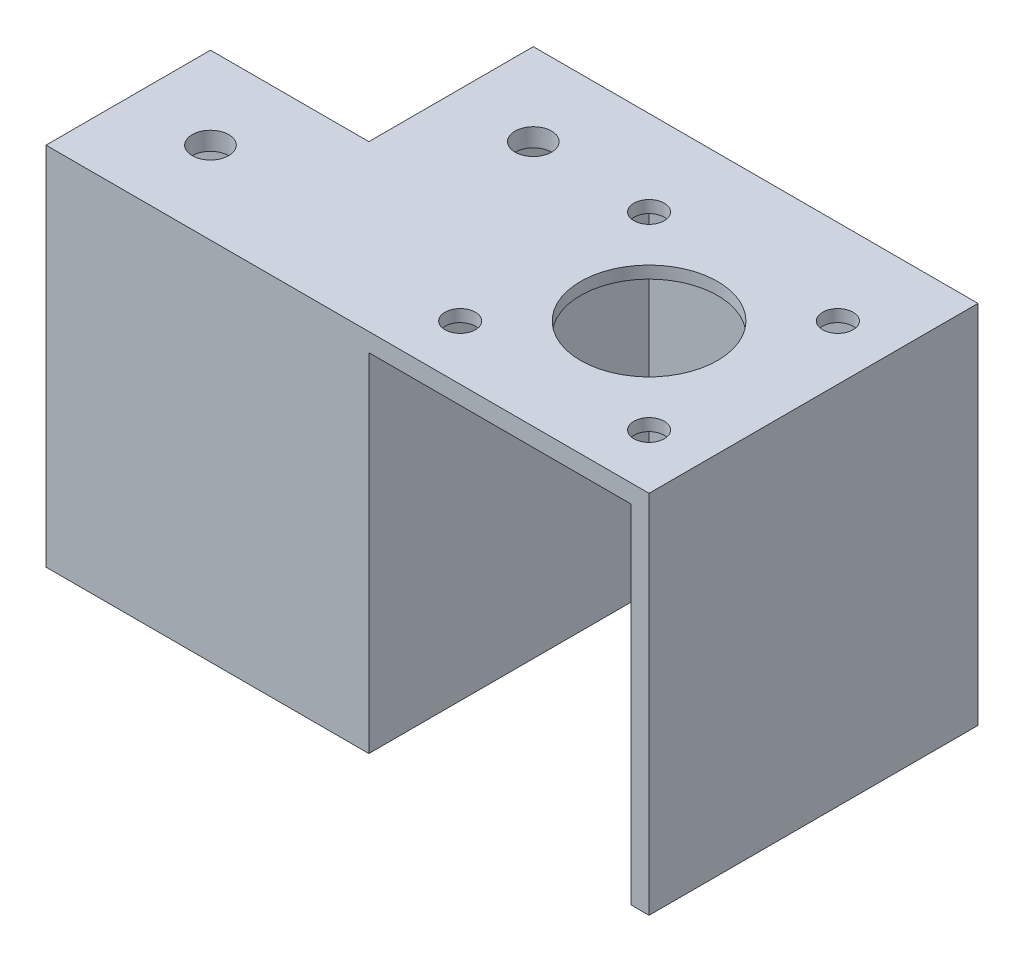
ISO-10303-21;
HEADER;
FILE_DESCRIPTION(('STEP AP214'),'2;1');
FILE_NAME('part.step','',(''),(''),'','','');
FILE_SCHEMA(('AUTOMOTIVE_DESIGN { 1 0 10303 214 1 1 1 1 }'));
ENDSEC;
DATA;
#1=APPLICATION_CONTEXT('core data for automotive mechanical design processes');
#2=APPLICATION_PROTOCOL_DEFINITION('international standard','automotive_design',2000,#1);
#3=PRODUCT_CONTEXT('',#1,'mechanical');
#4=PRODUCT('Part','Part','',(#3));
#5=PRODUCT_RELATED_PRODUCT_CATEGORY('part','',(#4));
#6=PRODUCT_DEFINITION_FORMATION('','',#4);
#7=PRODUCT_DEFINITION_CONTEXT('part definition',#1,'design');
#8=PRODUCT_DEFINITION('design','',#6,#7);
#9=PRODUCT_DEFINITION_SHAPE('','',#8);
#10=(LENGTH_UNIT() NAMED_UNIT(*) SI_UNIT(.MILLI.,.METRE.));
#11=(NAMED_UNIT(*) PLANE_ANGLE_UNIT() SI_UNIT($,.RADIAN.));
#12=(NAMED_UNIT(*) SI_UNIT($,.STERADIAN.) SOLID_ANGLE_UNIT());
#13=UNCERTAINTY_MEASURE_WITH_UNIT(LENGTH_MEASURE(1.E-05),#10,'distance_accuracy_value','');
#14=(GEOMETRIC_REPRESENTATION_CONTEXT(3) GLOBAL_UNCERTAINTY_ASSIGNED_CONTEXT((#13)) GLOBAL_UNIT_ASSIGNED_CONTEXT((#10,
#11,#12)) REPRESENTATION_CONTEXT('',''));
#15=CARTESIAN_POINT('',(0.,0.,0.));
#16=DIRECTION('',(0.,0.,1.));
#17=DIRECTION('',(1.,0.,0.));
#18=AXIS2_PLACEMENT_3D('',#15,#16,#17);
#19=CARTESIAN_POINT('',(-49.,-60.,24.5));
#20=DIRECTION('',(0.,0.,1.));
#21=DIRECTION('',(-1.,0.,0.));
#22=AXIS2_PLACEMENT_3D('',#19,#20,#21);
#23=PLANE('',#22);
#24=DIRECTION('',(0.,-1.,0.));
#25=VECTOR('',#24,1.);
#26=CARTESIAN_POINT('',(-70.5,-60.,24.5));
#27=LINE('',#26,#25);
#28=CARTESIAN_POINT('',(-70.5,-3.,24.5));
#29=VERTEX_POINT('',#28);
#30=CARTESIAN_POINT('',(-70.5,-60.,24.5));
#31=VERTEX_POINT('',#30);
#32=EDGE_CURVE('E173',#29,#31,#27,.T.);
#33=ORIENTED_EDGE('',*,*,#32,.F.);
#34=DIRECTION('',(-1.,0.,0.));
#35=VECTOR('',#34,1.);
#36=CARTESIAN_POINT('',(-27.5,-3.,24.5));
#37=LINE('',#36,#35);
#38=CARTESIAN_POINT('',(-27.5,-3.,24.5));
#39=VERTEX_POINT('',#38);
#40=EDGE_CURVE('E167',#39,#29,#37,.T.);
#41=ORIENTED_EDGE('',*,*,#40,.F.);
#42=DIRECTION('',(0.,1.,0.));
#43=VECTOR('',#42,1.);
#44=CARTESIAN_POINT('',(-27.5,-60.,24.5));
#45=LINE('',#44,#43);
#46=CARTESIAN_POINT('',(-27.5,-60.,24.5));
#47=VERTEX_POINT('',#46);
#48=EDGE_CURVE('E182',#47,#39,#45,.T.);
#49=ORIENTED_EDGE('',*,*,#48,.F.);
#50=DIRECTION('',(-1.,0.,0.));
#51=VECTOR('',#50,1.);
#52=CARTESIAN_POINT('',(-49.,-60.,24.5));
#53=LINE('',#52,#51);
#54=CARTESIAN_POINT('',(-24.5,-60.,24.5));
#55=VERTEX_POINT('',#54);
#56=EDGE_CURVE('E215',#55,#47,#53,.T.);
#57=ORIENTED_EDGE('',*,*,#56,.F.);
#58=DIRECTION('',(0.,1.,0.));
#59=VECTOR('',#58,1.);
#60=CARTESIAN_POINT('',(-24.5,-60.,24.5));
#61=LINE('',#60,#59);
#62=CARTESIAN_POINT('',(-24.5,0.,24.5));
#63=VERTEX_POINT('',#62);
#64=EDGE_CURVE('E48',#55,#63,#61,.T.);
#65=ORIENTED_EDGE('',*,*,#64,.T.);
#66=DIRECTION('',(-1.,0.,0.));
#67=VECTOR('',#66,1.);
#68=CARTESIAN_POINT('',(-49.,0.,24.5));
#69=LINE('',#68,#67);
#70=CARTESIAN_POINT('',(-123.5,0.,24.5));
#71=VERTEX_POINT('',#70);
#72=EDGE_CURVE('E244',#63,#71,#69,.T.);
#73=ORIENTED_EDGE('',*,*,#72,.T.);
#74=DIRECTION('',(0.,1.,0.));
#75=VECTOR('',#74,1.);
#76=CARTESIAN_POINT('',(-123.5,-60.,24.5));
#77=LINE('',#76,#75);
#78=CARTESIAN_POINT('',(-123.5,-60.,24.5));
#79=VERTEX_POINT('',#78);
#80=EDGE_CURVE('E232',#79,#71,#77,.T.);
#81=ORIENTED_EDGE('',*,*,#80,.F.);
#82=EDGE_CURVE('E219',#31,#79,#53,.T.);
#83=ORIENTED_EDGE('',*,*,#82,.F.);
#84=EDGE_LOOP('',(#33,#41,#49,#57,#65,#73,#81,#83));
#85=FACE_BOUND('',#84,.T.);
#86=ADVANCED_FACE('F40',(#85),#23,.T.);
#87=CARTESIAN_POINT('',(-24.5,-60.,0.));
#88=DIRECTION('',(1.,0.,0.));
#89=DIRECTION('',(0.,0.,1.));
#90=AXIS2_PLACEMENT_3D('',#87,#88,#89);
#91=PLANE('',#90);
#92=DIRECTION('',(0.,0.,1.));
#93=VECTOR('',#92,1.);
#94=CARTESIAN_POINT('',(-24.5,0.,0.));
#95=LINE('',#94,#93);
#96=CARTESIAN_POINT('',(-24.5,0.,-29.5));
#97=VERTEX_POINT('',#96);
#98=EDGE_CURVE('E258',#97,#63,#95,.T.);
#99=ORIENTED_EDGE('',*,*,#98,.T.);
#100=ORIENTED_EDGE('',*,*,#64,.F.);
#101=DIRECTION('',(0.,0.,1.));
#102=VECTOR('',#101,1.);
#103=CARTESIAN_POINT('',(-24.5,-60.,0.));
#104=LINE('',#103,#102);
#105=CARTESIAN_POINT('',(-24.5,-60.,-29.5));
#106=VERTEX_POINT('',#105);
#107=EDGE_CURVE('E230',#106,#55,#104,.T.);
#108=ORIENTED_EDGE('',*,*,#107,.F.);
#109=DIRECTION('',(0.,1.,0.));
#110=VECTOR('',#109,1.);
#111=CARTESIAN_POINT('',(-24.5,-60.,-29.5));
#112=LINE('',#111,#110);
#113=EDGE_CURVE('E265',#106,#97,#112,.T.);
#114=ORIENTED_EDGE('',*,*,#113,.T.);
#115=EDGE_LOOP('',(#99,#100,#108,#114));
#116=FACE_BOUND('',#115,.T.);
#117=ADVANCED_FACE('F324',(#116),#91,.T.);
#118=CARTESIAN_POINT('',(-49.,-60.,-29.5));
#119=DIRECTION('',(0.,0.,1.));
#120=DIRECTION('',(-1.,0.,0.));
#121=AXIS2_PLACEMENT_3D('',#118,#119,#120);
#122=PLANE('',#121);
#123=DIRECTION('',(0.,1.,0.));
#124=VECTOR('',#123,1.);
#125=CARTESIAN_POINT('',(-73.5,-2.99999999999999,-29.5));
#126=LINE('',#125,#124);
#127=CARTESIAN_POINT('',(-73.5,-24.,-29.5));
#128=VERTEX_POINT('',#127);
#129=CARTESIAN_POINT('',(-73.5,-2.99999999999999,-29.5));
#130=VERTEX_POINT('',#129);
#131=EDGE_CURVE('E389',#128,#130,#126,.T.);
#132=ORIENTED_EDGE('',*,*,#131,.T.);
#133=DIRECTION('',(-1.,0.,0.));
#134=VECTOR('',#133,1.);
#135=CARTESIAN_POINT('',(-94.5,-2.99999999999999,-29.5));
#136=LINE('',#135,#134);
#137=CARTESIAN_POINT('',(-94.5,-3.,-29.5));
#138=VERTEX_POINT('',#137);
#139=EDGE_CURVE('E381',#130,#138,#136,.T.);
#140=ORIENTED_EDGE('',*,*,#139,.T.);
#141=DIRECTION('',(0.,-1.,0.));
#142=VECTOR('',#141,1.);
#143=CARTESIAN_POINT('',(-94.5,-2.99999999999999,-29.5));
#144=LINE('',#143,#142);
#145=CARTESIAN_POINT('',(-94.5,-24.,-29.5));
#146=VERTEX_POINT('',#145);
#147=EDGE_CURVE('E382',#138,#146,#144,.T.);
#148=ORIENTED_EDGE('',*,*,#147,.T.);
#149=DIRECTION('',(1.,0.,0.));
#150=VECTOR('',#149,1.);
#151=CARTESIAN_POINT('',(-94.5,-24.,-29.5));
#152=LINE('',#151,#150);
#153=EDGE_CURVE('E385',#146,#128,#152,.T.);
#154=ORIENTED_EDGE('',*,*,#153,.T.);
#155=EDGE_LOOP('',(#132,#140,#148,#154));
#156=FACE_BOUND('',#155,.T.);
#157=DIRECTION('',(-1.,0.,0.));
#158=VECTOR('',#157,1.);
#159=CARTESIAN_POINT('',(-49.,0.,-29.5));
#160=LINE('',#159,#158);
#161=CARTESIAN_POINT('',(-97.5,0.,-29.5));
#162=VERTEX_POINT('',#161);
#163=EDGE_CURVE('E255',#97,#162,#160,.T.);
#164=ORIENTED_EDGE('',*,*,#163,.F.);
#165=ORIENTED_EDGE('',*,*,#113,.F.);
#166=DIRECTION('',(-1.,0.,0.));
#167=VECTOR('',#166,1.);
#168=CARTESIAN_POINT('',(-49.,-60.,-29.5));
#169=LINE('',#168,#167);
#170=CARTESIAN_POINT('',(-97.5,-60.,-29.5));
#171=VERTEX_POINT('',#170);
#172=EDGE_CURVE('E227',#106,#171,#169,.T.);
#173=ORIENTED_EDGE('',*,*,#172,.T.);
#174=DIRECTION('',(0.,1.,0.));
#175=VECTOR('',#174,1.);
#176=CARTESIAN_POINT('',(-97.5,-60.,-29.5));
#177=LINE('',#176,#175);
#178=EDGE_CURVE('E268',#171,#162,#177,.T.);
#179=ORIENTED_EDGE('',*,*,#178,.T.);
#180=EDGE_LOOP('',(#164,#165,#173,#179));
#181=FACE_BOUND('',#180,.T.);
#182=ADVANCED_FACE('F330',(#156,#181),#122,.F.);
#183=CARTESIAN_POINT('',(-97.5,-60.,0.));
#184=DIRECTION('',(1.,0.,0.));
#185=DIRECTION('',(0.,0.,1.));
#186=AXIS2_PLACEMENT_3D('',#183,#184,#185);
#187=PLANE('',#186);
#188=CARTESIAN_POINT('',(-97.5,-13.5,-16.));
#189=DIRECTION('',(1.,0.,0.));
#190=DIRECTION('',(0.,0.,-1.));
#191=AXIS2_PLACEMENT_3D('',#188,#189,#190);
#192=CIRCLE('',#191,3.);
#193=CARTESIAN_POINT('',(-97.5,-13.5,-19.));
#194=VERTEX_POINT('',#193);
#195=EDGE_CURVE('E401',#194,#194,#192,.T.);
#196=ORIENTED_EDGE('',*,*,#195,.T.);
#197=EDGE_LOOP('',(#196));
#198=FACE_BOUND('',#197,.T.);
#199=DIRECTION('',(0.,0.,1.));
#200=VECTOR('',#199,1.);
#201=CARTESIAN_POINT('',(-97.5,0.,0.));
#202=LINE('',#201,#200);
#203=CARTESIAN_POINT('',(-97.5,0.,-2.49999999999998));
#204=VERTEX_POINT('',#203);
#205=EDGE_CURVE('E252',#162,#204,#202,.T.);
#206=ORIENTED_EDGE('',*,*,#205,.F.);
#207=ORIENTED_EDGE('',*,*,#178,.F.);
#208=DIRECTION('',(0.,0.,1.));
#209=VECTOR('',#208,1.);
#210=CARTESIAN_POINT('',(-97.5,-60.,0.));
#211=LINE('',#210,#209);
#212=CARTESIAN_POINT('',(-97.5,-60.,-2.49999999999998));
#213=VERTEX_POINT('',#212);
#214=EDGE_CURVE('E224',#171,#213,#211,.T.);
#215=ORIENTED_EDGE('',*,*,#214,.T.);
#216=DIRECTION('',(0.,1.,0.));
#217=VECTOR('',#216,1.);
#218=CARTESIAN_POINT('',(-97.5,-60.,-2.49999999999998));
#219=LINE('',#218,#217);
#220=EDGE_CURVE('E271',#213,#204,#219,.T.);
#221=ORIENTED_EDGE('',*,*,#220,.T.);
#222=EDGE_LOOP('',(#206,#207,#215,#221));
#223=FACE_BOUND('',#222,.T.);
#224=ADVANCED_FACE('F448',(#198,#223),#187,.F.);
#225=CARTESIAN_POINT('',(-49.,-60.,-2.49999999999998));
#226=DIRECTION('',(0.,0.,1.));
#227=DIRECTION('',(-1.,0.,0.));
#228=AXIS2_PLACEMENT_3D('',#225,#226,#227);
#229=PLANE('',#228);
#230=CARTESIAN_POINT('',(-110.,-13.5,-2.49999999999998));
#231=DIRECTION('',(0.,0.,1.));
#232=DIRECTION('',(1.,0.,0.));
#233=AXIS2_PLACEMENT_3D('',#230,#231,#232);
#234=CIRCLE('',#233,3.);
#235=CARTESIAN_POINT('',(-107.,-13.5,-2.49999999999998));
#236=VERTEX_POINT('',#235);
#237=EDGE_CURVE('E420',#236,#236,#234,.T.);
#238=ORIENTED_EDGE('',*,*,#237,.T.);
#239=EDGE_LOOP('',(#238));
#240=FACE_BOUND('',#239,.T.);
#241=DIRECTION('',(-1.,0.,0.));
#242=VECTOR('',#241,1.);
#243=CARTESIAN_POINT('',(-49.,0.,-2.49999999999998));
#244=LINE('',#243,#242);
#245=CARTESIAN_POINT('',(-123.5,0.,-2.49999999999999));
#246=VERTEX_POINT('',#245);
#247=EDGE_CURVE('E249',#204,#246,#244,.T.);
#248=ORIENTED_EDGE('',*,*,#247,.F.);
#249=ORIENTED_EDGE('',*,*,#220,.F.);
#250=DIRECTION('',(-1.,0.,0.));
#251=VECTOR('',#250,1.);
#252=CARTESIAN_POINT('',(-49.,-60.,-2.49999999999998));
#253=LINE('',#252,#251);
#254=CARTESIAN_POINT('',(-123.5,-60.,-2.49999999999999));
#255=VERTEX_POINT('',#254);
#256=EDGE_CURVE('E221',#213,#255,#253,.T.);
#257=ORIENTED_EDGE('',*,*,#256,.T.);
#258=DIRECTION('',(0.,1.,0.));
#259=VECTOR('',#258,1.);
#260=CARTESIAN_POINT('',(-123.5,-60.,-2.49999999999999));
#261=LINE('',#260,#259);
#262=EDGE_CURVE('E274',#255,#246,#261,.T.);
#263=ORIENTED_EDGE('',*,*,#262,.T.);
#264=EDGE_LOOP('',(#248,#249,#257,#263));
#265=FACE_BOUND('',#264,.T.);
#266=ADVANCED_FACE('F444',(#240,#265),#229,.F.);
#267=CARTESIAN_POINT('',(-123.5,-60.,0.));
#268=DIRECTION('',(-1.,0.,0.));
#269=DIRECTION('',(0.,0.,-1.));
#270=AXIS2_PLACEMENT_3D('',#267,#268,#269);
#271=PLANE('',#270);
#272=DIRECTION('',(0.,0.,1.));
#273=VECTOR('',#272,1.);
#274=CARTESIAN_POINT('',(-123.5,-3.,0.500000000000022));
#275=LINE('',#274,#273);
#276=CARTESIAN_POINT('',(-123.5,-3.,0.500000000000022));
#277=VERTEX_POINT('',#276);
#278=CARTESIAN_POINT('',(-123.5,-3.,21.5));
#279=VERTEX_POINT('',#278);
#280=EDGE_CURVE('E400',#277,#279,#275,.T.);
#281=ORIENTED_EDGE('',*,*,#280,.T.);
#282=DIRECTION('',(0.,-1.,0.));
#283=VECTOR('',#282,1.);
#284=CARTESIAN_POINT('',(-123.5,-3.,21.5));
#285=LINE('',#284,#283);
#286=CARTESIAN_POINT('',(-123.5,-24.,21.5));
#287=VERTEX_POINT('',#286);
#288=EDGE_CURVE('E404',#279,#287,#285,.T.);
#289=ORIENTED_EDGE('',*,*,#288,.T.);
#290=DIRECTION('',(0.,0.,-1.));
#291=VECTOR('',#290,1.);
#292=CARTESIAN_POINT('',(-123.5,-24.,0.500000000000019));
#293=LINE('',#292,#291);
#294=CARTESIAN_POINT('',(-123.5,-24.,0.500000000000019));
#295=VERTEX_POINT('',#294);
#296=EDGE_CURVE('E396',#287,#295,#293,.T.);
#297=ORIENTED_EDGE('',*,*,#296,.T.);
#298=DIRECTION('',(0.,1.,0.));
#299=VECTOR('',#298,1.);
#300=CARTESIAN_POINT('',(-123.5,-3.,0.500000000000022));
#301=LINE('',#300,#299);
#302=EDGE_CURVE('E397',#295,#277,#301,.T.);
#303=ORIENTED_EDGE('',*,*,#302,.T.);
#304=EDGE_LOOP('',(#281,#289,#297,#303));
#305=FACE_BOUND('',#304,.T.);
#306=DIRECTION('',(0.,0.,-1.));
#307=VECTOR('',#306,1.);
#308=CARTESIAN_POINT('',(-123.5,0.,0.));
#309=LINE('',#308,#307);
#310=EDGE_CURVE('E247',#71,#246,#309,.T.);
#311=ORIENTED_EDGE('',*,*,#310,.T.);
#312=ORIENTED_EDGE('',*,*,#262,.F.);
#313=DIRECTION('',(0.,0.,-1.));
#314=VECTOR('',#313,1.);
#315=CARTESIAN_POINT('',(-123.5,-60.,0.));
#316=LINE('',#315,#314);
#317=EDGE_CURVE('E218',#79,#255,#316,.T.);
#318=ORIENTED_EDGE('',*,*,#317,.F.);
#319=ORIENTED_EDGE('',*,*,#80,.T.);
#320=EDGE_LOOP('',(#311,#312,#318,#319));
#321=FACE_BOUND('',#320,.T.);
#322=ADVANCED_FACE('F299',(#305,#321),#271,.T.);
#323=CARTESIAN_POINT('',(-64.5,-60.,-15.5));
#324=DIRECTION('',(0.,1.,0.));
#325=DIRECTION('',(0.,0.,1.));
#326=AXIS2_PLACEMENT_3D('',#323,#324,#325);
#327=CYLINDRICAL_SURFACE('',#326,2.5);
#328=CARTESIAN_POINT('',(-64.5,-2.,-15.5));
#329=DIRECTION('',(0.,-1.,0.));
#330=DIRECTION('',(0.,0.,1.));
#331=AXIS2_PLACEMENT_3D('',#328,#329,#330);
#332=CIRCLE('',#331,2.5);
#333=CARTESIAN_POINT('',(-64.5,-2.,-13.));
#334=VERTEX_POINT('',#333);
#335=EDGE_CURVE('E211',#334,#334,#332,.F.);
#336=ORIENTED_EDGE('',*,*,#335,.F.);
#337=EDGE_LOOP('',(#336));
#338=FACE_BOUND('',#337,.T.);
#339=CARTESIAN_POINT('',(-64.5,0.,-15.5));
#340=DIRECTION('',(0.,-1.,0.));
#341=DIRECTION('',(0.,0.,1.));
#342=AXIS2_PLACEMENT_3D('',#339,#340,#341);
#343=CIRCLE('',#342,2.5);
#344=CARTESIAN_POINT('',(-64.5,0.,-13.));
#345=VERTEX_POINT('',#344);
#346=EDGE_CURVE('E241',#345,#345,#343,.T.);
#347=ORIENTED_EDGE('',*,*,#346,.F.);
#348=EDGE_LOOP('',(#347));
#349=FACE_BOUND('',#348,.T.);
#350=ADVANCED_FACE('F295',(#338,#349),#327,.F.);
#351=CARTESIAN_POINT('',(-33.5,-60.,-15.5));
#352=DIRECTION('',(0.,1.,0.));
#353=DIRECTION('',(0.,0.,1.));
#354=AXIS2_PLACEMENT_3D('',#351,#352,#353);
#355=CYLINDRICAL_SURFACE('',#354,2.5);
#356=CARTESIAN_POINT('',(-33.5,-2.,-15.5));
#357=DIRECTION('',(0.,-1.,0.));
#358=DIRECTION('',(0.,0.,1.));
#359=AXIS2_PLACEMENT_3D('',#356,#357,#358);
#360=CIRCLE('',#359,2.5);
#361=CARTESIAN_POINT('',(-33.5,-2.,-13.));
#362=VERTEX_POINT('',#361);
#363=EDGE_CURVE('E208',#362,#362,#360,.F.);
#364=ORIENTED_EDGE('',*,*,#363,.F.);
#365=EDGE_LOOP('',(#364));
#366=FACE_BOUND('',#365,.T.);
#367=CARTESIAN_POINT('',(-33.5,0.,-15.5));
#368=DIRECTION('',(0.,-1.,0.));
#369=DIRECTION('',(0.,0.,1.));
#370=AXIS2_PLACEMENT_3D('',#367,#368,#369);
#371=CIRCLE('',#370,2.5);
#372=CARTESIAN_POINT('',(-33.5,0.,-13.));
#373=VERTEX_POINT('',#372);
#374=EDGE_CURVE('E238',#373,#373,#371,.T.);
#375=ORIENTED_EDGE('',*,*,#374,.F.);
#376=EDGE_LOOP('',(#375));
#377=FACE_BOUND('',#376,.T.);
#378=ADVANCED_FACE('F298',(#366,#377),#355,.F.);
#379=CARTESIAN_POINT('',(-64.5,-60.,15.5));
#380=DIRECTION('',(0.,1.,0.));
#381=DIRECTION('',(0.,0.,1.));
#382=AXIS2_PLACEMENT_3D('',#379,#380,#381);
#383=CYLINDRICAL_SURFACE('',#382,2.5);
#384=CARTESIAN_POINT('',(-64.5,-2.,15.5));
#385=DIRECTION('',(0.,-1.,0.));
#386=DIRECTION('',(0.,0.,1.));
#387=AXIS2_PLACEMENT_3D('',#384,#385,#386);
#388=CIRCLE('',#387,2.5);
#389=CARTESIAN_POINT('',(-64.5,-2.,18.));
#390=VERTEX_POINT('',#389);
#391=EDGE_CURVE('E205',#390,#390,#388,.T.);
#392=ORIENTED_EDGE('',*,*,#391,.T.);
#393=EDGE_LOOP('',(#392));
#394=FACE_BOUND('',#393,.T.);
#395=CARTESIAN_POINT('',(-64.5,0.,15.5));
#396=DIRECTION('',(0.,-1.,0.));
#397=DIRECTION('',(0.,0.,1.));
#398=AXIS2_PLACEMENT_3D('',#395,#396,#397);
#399=CIRCLE('',#398,2.5);
#400=CARTESIAN_POINT('',(-64.5,0.,18.));
#401=VERTEX_POINT('',#400);
#402=EDGE_CURVE('E235',#401,#401,#399,.F.);
#403=ORIENTED_EDGE('',*,*,#402,.T.);
#404=EDGE_LOOP('',(#403));
#405=FACE_BOUND('',#404,.T.);
#406=ADVANCED_FACE('F320',(#394,#405),#383,.F.);
#407=CARTESIAN_POINT('',(-49.,-60.,0.));
#408=DIRECTION('',(0.,1.,0.));
#409=DIRECTION('',(0.,0.,1.));
#410=AXIS2_PLACEMENT_3D('',#407,#408,#409);
#411=CYLINDRICAL_SURFACE('',#410,11.25);
#412=CARTESIAN_POINT('',(-49.,-2.,0.));
#413=DIRECTION('',(0.,-1.,0.));
#414=DIRECTION('',(0.,0.,1.));
#415=AXIS2_PLACEMENT_3D('',#412,#413,#414);
#416=CIRCLE('',#415,11.25);
#417=CARTESIAN_POINT('',(-49.,-2.,11.25));
#418=VERTEX_POINT('',#417);
#419=EDGE_CURVE('E202',#418,#418,#416,.F.);
#420=ORIENTED_EDGE('',*,*,#419,.F.);
#421=EDGE_LOOP('',(#420));
#422=FACE_BOUND('',#421,.T.);
#423=CARTESIAN_POINT('',(-49.,0.,0.));
#424=DIRECTION('',(0.,-1.,0.));
#425=DIRECTION('',(0.,0.,1.));
#426=AXIS2_PLACEMENT_3D('',#423,#424,#425);
#427=CIRCLE('',#426,11.25);
#428=CARTESIAN_POINT('',(-49.,0.,11.25));
#429=VERTEX_POINT('',#428);
#430=EDGE_CURVE('E214',#429,#429,#427,.T.);
#431=ORIENTED_EDGE('',*,*,#430,.F.);
#432=EDGE_LOOP('',(#431));
#433=FACE_BOUND('',#432,.T.);
#434=ADVANCED_FACE('F42',(#422,#433),#411,.F.);
#435=CARTESIAN_POINT('',(-33.5,-60.,15.5));
#436=DIRECTION('',(0.,1.,0.));
#437=DIRECTION('',(0.,0.,1.));
#438=AXIS2_PLACEMENT_3D('',#435,#436,#437);
#439=CYLINDRICAL_SURFACE('',#438,2.5);
#440=CARTESIAN_POINT('',(-33.5,-2.,15.5));
#441=DIRECTION('',(0.,-1.,0.));
#442=DIRECTION('',(0.,0.,1.));
#443=AXIS2_PLACEMENT_3D('',#440,#441,#442);
#444=CIRCLE('',#443,2.5);
#445=CARTESIAN_POINT('',(-33.5,-2.,18.));
#446=VERTEX_POINT('',#445);
#447=EDGE_CURVE('E201',#446,#446,#444,.T.);
#448=ORIENTED_EDGE('',*,*,#447,.T.);
#449=EDGE_LOOP('',(#448));
#450=FACE_BOUND('',#449,.T.);
#451=CARTESIAN_POINT('',(-33.5,0.,15.5));
#452=DIRECTION('',(0.,-1.,0.));
#453=DIRECTION('',(0.,0.,1.));
#454=AXIS2_PLACEMENT_3D('',#451,#452,#453);
#455=CIRCLE('',#454,2.5);
#456=CARTESIAN_POINT('',(-33.5,0.,18.));
#457=VERTEX_POINT('',#456);
#458=EDGE_CURVE('E260',#457,#457,#455,.F.);
#459=ORIENTED_EDGE('',*,*,#458,.T.);
#460=EDGE_LOOP('',(#459));
#461=FACE_BOUND('',#460,.T.);
#462=ADVANCED_FACE('F281',(#450,#461),#439,.F.);
#463=CARTESIAN_POINT('',(-49.,-60.,0.));
#464=DIRECTION('',(0.,1.,0.));
#465=DIRECTION('',(0.,0.,1.));
#466=AXIS2_PLACEMENT_3D('',#463,#464,#465);
#467=PLANE('',#466);
#468=DIRECTION('',(0.,0.,1.));
#469=VECTOR('',#468,1.);
#470=CARTESIAN_POINT('',(-70.5,-60.,21.5));
#471=LINE('',#470,#469);
#472=CARTESIAN_POINT('',(-70.5,-60.,-21.5));
#473=VERTEX_POINT('',#472);
#474=EDGE_CURVE('E355',#473,#31,#471,.T.);
#475=ORIENTED_EDGE('',*,*,#474,.T.);
#476=ORIENTED_EDGE('',*,*,#82,.T.);
#477=ORIENTED_EDGE('',*,*,#317,.T.);
#478=ORIENTED_EDGE('',*,*,#256,.F.);
#479=ORIENTED_EDGE('',*,*,#214,.F.);
#480=ORIENTED_EDGE('',*,*,#172,.F.);
#481=ORIENTED_EDGE('',*,*,#107,.T.);
#482=ORIENTED_EDGE('',*,*,#56,.T.);
#483=DIRECTION('',(0.,0.,-1.));
#484=VECTOR('',#483,1.);
#485=CARTESIAN_POINT('',(-27.5,-60.,21.5));
#486=LINE('',#485,#484);
#487=CARTESIAN_POINT('',(-27.5,-60.,-21.5));
#488=VERTEX_POINT('',#487);
#489=EDGE_CURVE('E360',#47,#488,#486,.T.);
#490=ORIENTED_EDGE('',*,*,#489,.T.);
#491=DIRECTION('',(-1.,0.,0.));
#492=VECTOR('',#491,1.);
#493=CARTESIAN_POINT('',(-27.5,-60.,-21.5));
#494=LINE('',#493,#492);
#495=EDGE_CURVE('E357',#488,#473,#494,.T.);
#496=ORIENTED_EDGE('',*,*,#495,.T.);
#497=EDGE_LOOP('',(#475,#476,#477,#478,#479,#480,#481,#482,#490,#496));
#498=FACE_BOUND('',#497,.T.);
#499=ADVANCED_FACE('F305',(#498),#467,.F.);
#500=CARTESIAN_POINT('',(-49.,0.,0.));
#501=DIRECTION('',(0.,1.,0.));
#502=DIRECTION('',(0.,0.,1.));
#503=AXIS2_PLACEMENT_3D('',#500,#501,#502);
#504=PLANE('',#503);
#505=CARTESIAN_POINT('',(-110.,0.,11.));
#506=DIRECTION('',(0.,-1.,0.));
#507=DIRECTION('',(0.,0.,1.));
#508=AXIS2_PLACEMENT_3D('',#505,#506,#507);
#509=CIRCLE('',#508,3.);
#510=CARTESIAN_POINT('',(-110.,0.,14.));
#511=VERTEX_POINT('',#510);
#512=EDGE_CURVE('E426',#511,#511,#509,.T.);
#513=ORIENTED_EDGE('',*,*,#512,.T.);
#514=EDGE_LOOP('',(#513));
#515=FACE_BOUND('',#514,.T.);
#516=CARTESIAN_POINT('',(-84.,0.,-16.));
#517=DIRECTION('',(0.,-1.,0.));
#518=DIRECTION('',(0.,0.,1.));
#519=AXIS2_PLACEMENT_3D('',#516,#517,#518);
#520=CIRCLE('',#519,3.);
#521=CARTESIAN_POINT('',(-84.,0.,-13.));
#522=VERTEX_POINT('',#521);
#523=EDGE_CURVE('E414',#522,#522,#520,.T.);
#524=ORIENTED_EDGE('',*,*,#523,.T.);
#525=EDGE_LOOP('',(#524));
#526=FACE_BOUND('',#525,.T.);
#527=ORIENTED_EDGE('',*,*,#430,.T.);
#528=EDGE_LOOP('',(#527));
#529=FACE_BOUND('',#528,.T.);
#530=ORIENTED_EDGE('',*,*,#402,.F.);
#531=EDGE_LOOP('',(#530));
#532=FACE_BOUND('',#531,.T.);
#533=ORIENTED_EDGE('',*,*,#374,.T.);
#534=EDGE_LOOP('',(#533));
#535=FACE_BOUND('',#534,.T.);
#536=ORIENTED_EDGE('',*,*,#346,.T.);
#537=EDGE_LOOP('',(#536));
#538=FACE_BOUND('',#537,.T.);
#539=ORIENTED_EDGE('',*,*,#72,.F.);
#540=ORIENTED_EDGE('',*,*,#98,.F.);
#541=ORIENTED_EDGE('',*,*,#163,.T.);
#542=ORIENTED_EDGE('',*,*,#205,.T.);
#543=ORIENTED_EDGE('',*,*,#247,.T.);
#544=ORIENTED_EDGE('',*,*,#310,.F.);
#545=EDGE_LOOP('',(#539,#540,#541,#542,#543,#544));
#546=FACE_BOUND('',#545,.T.);
#547=ORIENTED_EDGE('',*,*,#458,.F.);
#548=EDGE_LOOP('',(#547));
#549=FACE_BOUND('',#548,.T.);
#550=ADVANCED_FACE('F288',(#515,#526,#529,#532,#535,#538,#546,#549),#504,.T.);
#551=CARTESIAN_POINT('',(-49.,-2.,0.));
#552=DIRECTION('',(0.,1.,0.));
#553=DIRECTION('',(0.,0.,1.));
#554=AXIS2_PLACEMENT_3D('',#551,#552,#553);
#555=PLANE('',#554);
#556=ORIENTED_EDGE('',*,*,#363,.T.);
#557=EDGE_LOOP('',(#556));
#558=FACE_BOUND('',#557,.T.);
#559=ORIENTED_EDGE('',*,*,#391,.F.);
#560=EDGE_LOOP('',(#559));
#561=FACE_BOUND('',#560,.T.);
#562=DIRECTION('',(1.,0.,0.));
#563=VECTOR('',#562,1.);
#564=CARTESIAN_POINT('',(-27.5,-2.,21.5));
#565=LINE('',#564,#563);
#566=CARTESIAN_POINT('',(-70.5,-2.,21.5));
#567=VERTEX_POINT('',#566);
#568=CARTESIAN_POINT('',(-27.5,-2.,21.5));
#569=VERTEX_POINT('',#568);
#570=EDGE_CURVE('E188',#567,#569,#565,.T.);
#571=ORIENTED_EDGE('',*,*,#570,.F.);
#572=DIRECTION('',(0.,0.,1.));
#573=VECTOR('',#572,1.);
#574=CARTESIAN_POINT('',(-70.5,-2.,21.5));
#575=LINE('',#574,#573);
#576=CARTESIAN_POINT('',(-70.5,-2.,-21.5));
#577=VERTEX_POINT('',#576);
#578=EDGE_CURVE('E186',#577,#567,#575,.T.);
#579=ORIENTED_EDGE('',*,*,#578,.F.);
#580=DIRECTION('',(-1.,0.,0.));
#581=VECTOR('',#580,1.);
#582=CARTESIAN_POINT('',(-27.5,-2.,-21.5));
#583=LINE('',#582,#581);
#584=CARTESIAN_POINT('',(-27.5,-2.,-21.5));
#585=VERTEX_POINT('',#584);
#586=EDGE_CURVE('E195',#585,#577,#583,.T.);
#587=ORIENTED_EDGE('',*,*,#586,.F.);
#588=DIRECTION('',(0.,0.,-1.));
#589=VECTOR('',#588,1.);
#590=CARTESIAN_POINT('',(-27.5,-2.,21.5));
#591=LINE('',#590,#589);
#592=EDGE_CURVE('E199',#569,#585,#591,.T.);
#593=ORIENTED_EDGE('',*,*,#592,.F.);
#594=EDGE_LOOP('',(#571,#579,#587,#593));
#595=FACE_BOUND('',#594,.T.);
#596=ORIENTED_EDGE('',*,*,#447,.F.);
#597=EDGE_LOOP('',(#596));
#598=FACE_BOUND('',#597,.T.);
#599=ORIENTED_EDGE('',*,*,#419,.T.);
#600=EDGE_LOOP('',(#599));
#601=FACE_BOUND('',#600,.T.);
#602=ORIENTED_EDGE('',*,*,#335,.T.);
#603=EDGE_LOOP('',(#602));
#604=FACE_BOUND('',#603,.T.);
#605=ADVANCED_FACE('F284',(#558,#561,#595,#598,#601,#604),#555,.F.);
#606=CARTESIAN_POINT('',(-27.5,60.8111831820431,21.5));
#607=DIRECTION('',(1.,0.,0.));
#608=DIRECTION('',(0.,0.,1.));
#609=AXIS2_PLACEMENT_3D('',#606,#607,#608);
#610=PLANE('',#609);
#611=DIRECTION('',(0.,-1.,0.));
#612=VECTOR('',#611,1.);
#613=CARTESIAN_POINT('',(-27.5,60.8111831820431,21.5));
#614=LINE('',#613,#612);
#615=CARTESIAN_POINT('',(-27.5,-3.,21.5));
#616=VERTEX_POINT('',#615);
#617=EDGE_CURVE('E181',#569,#616,#614,.T.);
#618=ORIENTED_EDGE('',*,*,#617,.F.);
#619=ORIENTED_EDGE('',*,*,#592,.T.);
#620=DIRECTION('',(0.,-1.,0.));
#621=VECTOR('',#620,1.);
#622=CARTESIAN_POINT('',(-27.5,60.8111831820431,-21.5));
#623=LINE('',#622,#621);
#624=EDGE_CURVE('E197',#585,#488,#623,.T.);
#625=ORIENTED_EDGE('',*,*,#624,.T.);
#626=ORIENTED_EDGE('',*,*,#489,.F.);
#627=ORIENTED_EDGE('',*,*,#48,.T.);
#628=DIRECTION('',(0.,0.,1.));
#629=VECTOR('',#628,1.);
#630=CARTESIAN_POINT('',(-27.5,-3.,-29.501));
#631=LINE('',#630,#629);
#632=EDGE_CURVE('E172',#616,#39,#631,.T.);
#633=ORIENTED_EDGE('',*,*,#632,.F.);
#634=EDGE_LOOP('',(#618,#619,#625,#626,#627,#633));
#635=FACE_BOUND('',#634,.T.);
#636=ADVANCED_FACE('F287',(#635),#610,.F.);
#637=CARTESIAN_POINT('',(-27.5,60.8111831820431,-21.5));
#638=DIRECTION('',(0.,0.,-1.));
#639=DIRECTION('',(1.,0.,0.));
#640=AXIS2_PLACEMENT_3D('',#637,#638,#639);
#641=PLANE('',#640);
#642=ORIENTED_EDGE('',*,*,#624,.F.);
#643=ORIENTED_EDGE('',*,*,#586,.T.);
#644=DIRECTION('',(0.,-1.,0.));
#645=VECTOR('',#644,1.);
#646=CARTESIAN_POINT('',(-70.5,60.8111831820431,-21.5));
#647=LINE('',#646,#645);
#648=EDGE_CURVE('E191',#577,#473,#647,.T.);
#649=ORIENTED_EDGE('',*,*,#648,.T.);
#650=ORIENTED_EDGE('',*,*,#495,.F.);
#651=EDGE_LOOP('',(#642,#643,#649,#650));
#652=FACE_BOUND('',#651,.T.);
#653=ADVANCED_FACE('F456',(#652),#641,.F.);
#654=CARTESIAN_POINT('',(-70.5,60.8111831820431,21.5));
#655=DIRECTION('',(-1.,0.,0.));
#656=DIRECTION('',(0.,0.,-1.));
#657=AXIS2_PLACEMENT_3D('',#654,#655,#656);
#658=PLANE('',#657);
#659=ORIENTED_EDGE('',*,*,#648,.F.);
#660=ORIENTED_EDGE('',*,*,#578,.T.);
#661=DIRECTION('',(0.,-1.,0.));
#662=VECTOR('',#661,1.);
#663=CARTESIAN_POINT('',(-70.5,60.8111831820431,21.5));
#664=LINE('',#663,#662);
#665=CARTESIAN_POINT('',(-70.5,-3.,21.5));
#666=VERTEX_POINT('',#665);
#667=EDGE_CURVE('E179',#567,#666,#664,.T.);
#668=ORIENTED_EDGE('',*,*,#667,.T.);
#669=DIRECTION('',(0.,0.,1.));
#670=VECTOR('',#669,1.);
#671=CARTESIAN_POINT('',(-70.5,-3.,-29.501));
#672=LINE('',#671,#670);
#673=EDGE_CURVE('E164',#666,#29,#672,.T.);
#674=ORIENTED_EDGE('',*,*,#673,.T.);
#675=ORIENTED_EDGE('',*,*,#32,.T.);
#676=ORIENTED_EDGE('',*,*,#474,.F.);
#677=EDGE_LOOP('',(#659,#660,#668,#674,#675,#676));
#678=FACE_BOUND('',#677,.T.);
#679=ADVANCED_FACE('F184',(#678),#658,.F.);
#680=CARTESIAN_POINT('',(-27.5,60.8111831820431,21.5));
#681=DIRECTION('',(0.,0.,1.));
#682=DIRECTION('',(-1.,0.,0.));
#683=AXIS2_PLACEMENT_3D('',#680,#681,#682);
#684=PLANE('',#683);
#685=ORIENTED_EDGE('',*,*,#617,.T.);
#686=DIRECTION('',(1.,0.,0.));
#687=VECTOR('',#686,1.);
#688=CARTESIAN_POINT('',(-27.5,-3.,21.5));
#689=LINE('',#688,#687);
#690=EDGE_CURVE('E55',#666,#616,#689,.T.);
#691=ORIENTED_EDGE('',*,*,#690,.F.);
#692=ORIENTED_EDGE('',*,*,#667,.F.);
#693=ORIENTED_EDGE('',*,*,#570,.T.);
#694=EDGE_LOOP('',(#685,#691,#692,#693));
#695=FACE_BOUND('',#694,.T.);
#696=ADVANCED_FACE('F177',(#695),#684,.F.);
#697=CARTESIAN_POINT('',(-49.,-60.,21.5));
#698=DIRECTION('',(0.,0.,1.));
#699=DIRECTION('',(-1.,0.,0.));
#700=AXIS2_PLACEMENT_3D('',#697,#698,#699);
#701=PLANE('',#700);
#702=DIRECTION('',(-1.,0.,0.));
#703=VECTOR('',#702,1.);
#704=CARTESIAN_POINT('',(-94.5,-2.99999999999999,21.5));
#705=LINE('',#704,#703);
#706=CARTESIAN_POINT('',(-73.5,-2.99999999999999,21.5));
#707=VERTEX_POINT('',#706);
#708=EDGE_CURVE('E374',#707,#279,#705,.T.);
#709=ORIENTED_EDGE('',*,*,#708,.F.);
#710=DIRECTION('',(0.,1.,0.));
#711=VECTOR('',#710,1.);
#712=CARTESIAN_POINT('',(-73.5,-2.99999999999999,21.5));
#713=LINE('',#712,#711);
#714=CARTESIAN_POINT('',(-73.5,-24.,21.5));
#715=VERTEX_POINT('',#714);
#716=EDGE_CURVE('E370',#715,#707,#713,.T.);
#717=ORIENTED_EDGE('',*,*,#716,.F.);
#718=DIRECTION('',(1.,0.,0.));
#719=VECTOR('',#718,1.);
#720=CARTESIAN_POINT('',(-94.5,-24.,21.5));
#721=LINE('',#720,#719);
#722=EDGE_CURVE('E371',#287,#715,#721,.T.);
#723=ORIENTED_EDGE('',*,*,#722,.F.);
#724=ORIENTED_EDGE('',*,*,#288,.F.);
#725=EDGE_LOOP('',(#709,#717,#723,#724));
#726=FACE_BOUND('',#725,.T.);
#727=ADVANCED_FACE('F468',(#726),#701,.F.);
#728=CARTESIAN_POINT('',(-94.5,-24.,54.198484809835));
#729=DIRECTION('',(0.,-1.,0.));
#730=DIRECTION('',(0.,0.,-1.));
#731=AXIS2_PLACEMENT_3D('',#728,#729,#730);
#732=PLANE('',#731);
#733=ORIENTED_EDGE('',*,*,#153,.F.);
#734=DIRECTION('',(0.,0.,-1.));
#735=VECTOR('',#734,1.);
#736=CARTESIAN_POINT('',(-94.5,-24.,54.198484809835));
#737=LINE('',#736,#735);
#738=CARTESIAN_POINT('',(-94.5,-24.,0.500000000000012));
#739=VERTEX_POINT('',#738);
#740=EDGE_CURVE('E363',#739,#146,#737,.T.);
#741=ORIENTED_EDGE('',*,*,#740,.F.);
#742=DIRECTION('',(-1.,0.,0.));
#743=VECTOR('',#742,1.);
#744=CARTESIAN_POINT('',(-43.801515190165,-24.,0.499999999999999));
#745=LINE('',#744,#743);
#746=EDGE_CURVE('E63',#739,#295,#745,.T.);
#747=ORIENTED_EDGE('',*,*,#746,.T.);
#748=ORIENTED_EDGE('',*,*,#296,.F.);
#749=ORIENTED_EDGE('',*,*,#722,.T.);
#750=DIRECTION('',(0.,0.,-1.));
#751=VECTOR('',#750,1.);
#752=CARTESIAN_POINT('',(-73.5,-24.,54.198484809835));
#753=LINE('',#752,#751);
#754=EDGE_CURVE('E368',#715,#128,#753,.T.);
#755=ORIENTED_EDGE('',*,*,#754,.T.);
#756=EDGE_LOOP('',(#733,#741,#747,#748,#749,#755));
#757=FACE_BOUND('',#756,.T.);
#758=ADVANCED_FACE('F471',(#757),#732,.F.);
#759=CARTESIAN_POINT('',(-73.5,-2.99999999999999,54.198484809835));
#760=DIRECTION('',(1.,0.,0.));
#761=DIRECTION('',(0.,-1.,0.));
#762=AXIS2_PLACEMENT_3D('',#759,#760,#761);
#763=PLANE('',#762);
#764=ORIENTED_EDGE('',*,*,#131,.F.);
#765=ORIENTED_EDGE('',*,*,#754,.F.);
#766=ORIENTED_EDGE('',*,*,#716,.T.);
#767=DIRECTION('',(0.,0.,-1.));
#768=VECTOR('',#767,1.);
#769=CARTESIAN_POINT('',(-73.5,-2.99999999999999,54.198484809835));
#770=LINE('',#769,#768);
#771=EDGE_CURVE('E372',#707,#130,#770,.T.);
#772=ORIENTED_EDGE('',*,*,#771,.T.);
#773=EDGE_LOOP('',(#764,#765,#766,#772));
#774=FACE_BOUND('',#773,.T.);
#775=ADVANCED_FACE('F475',(#774),#763,.F.);
#776=CARTESIAN_POINT('',(-94.5,-2.99999999999999,54.198484809835));
#777=DIRECTION('',(0.,1.,0.));
#778=DIRECTION('',(1.,0.,0.));
#779=AXIS2_PLACEMENT_3D('',#776,#777,#778);
#780=PLANE('',#779);
#781=CARTESIAN_POINT('',(-110.,-3.,11.));
#782=DIRECTION('',(0.,-1.,0.));
#783=DIRECTION('',(1.,0.,0.));
#784=AXIS2_PLACEMENT_3D('',#781,#782,#783);
#785=CIRCLE('',#784,3.);
#786=CARTESIAN_POINT('',(-107.,-3.,11.));
#787=VERTEX_POINT('',#786);
#788=EDGE_CURVE('E429',#787,#787,#785,.F.);
#789=ORIENTED_EDGE('',*,*,#788,.T.);
#790=EDGE_LOOP('',(#789));
#791=FACE_BOUND('',#790,.T.);
#792=CARTESIAN_POINT('',(-84.,-3.,-16.));
#793=DIRECTION('',(0.,-1.,0.));
#794=DIRECTION('',(1.,0.,0.));
#795=AXIS2_PLACEMENT_3D('',#792,#793,#794);
#796=CIRCLE('',#795,3.);
#797=CARTESIAN_POINT('',(-81.,-3.,-16.));
#798=VERTEX_POINT('',#797);
#799=EDGE_CURVE('E417',#798,#798,#796,.F.);
#800=ORIENTED_EDGE('',*,*,#799,.T.);
#801=EDGE_LOOP('',(#800));
#802=FACE_BOUND('',#801,.T.);
#803=DIRECTION('',(0.,0.,-1.));
#804=VECTOR('',#803,1.);
#805=CARTESIAN_POINT('',(-94.5,-2.99999999999999,54.198484809835));
#806=LINE('',#805,#804);
#807=CARTESIAN_POINT('',(-94.5,-2.99999999999999,0.500000000000025));
#808=VERTEX_POINT('',#807);
#809=EDGE_CURVE('E367',#808,#138,#806,.T.);
#810=ORIENTED_EDGE('',*,*,#809,.T.);
#811=ORIENTED_EDGE('',*,*,#139,.F.);
#812=ORIENTED_EDGE('',*,*,#771,.F.);
#813=ORIENTED_EDGE('',*,*,#708,.T.);
#814=ORIENTED_EDGE('',*,*,#280,.F.);
#815=DIRECTION('',(-1.,0.,0.));
#816=VECTOR('',#815,1.);
#817=CARTESIAN_POINT('',(-43.801515190165,-3.,0.500000000000001));
#818=LINE('',#817,#816);
#819=EDGE_CURVE('E386',#808,#277,#818,.T.);
#820=ORIENTED_EDGE('',*,*,#819,.F.);
#821=EDGE_LOOP('',(#810,#811,#812,#813,#814,#820));
#822=FACE_BOUND('',#821,.T.);
#823=ADVANCED_FACE('F478',(#791,#802,#822),#780,.F.);
#824=CARTESIAN_POINT('',(-94.5,-2.99999999999999,54.198484809835));
#825=DIRECTION('',(-1.,0.,0.));
#826=DIRECTION('',(0.,1.,0.));
#827=AXIS2_PLACEMENT_3D('',#824,#825,#826);
#828=PLANE('',#827);
#829=CARTESIAN_POINT('',(-94.5,-13.5,-16.));
#830=DIRECTION('',(1.,0.,0.));
#831=DIRECTION('',(0.,1.,0.));
#832=AXIS2_PLACEMENT_3D('',#829,#830,#831);
#833=CIRCLE('',#832,3.);
#834=CARTESIAN_POINT('',(-94.5,-13.5,-19.));
#835=VERTEX_POINT('',#834);
#836=EDGE_CURVE('E411',#835,#835,#833,.F.);
#837=ORIENTED_EDGE('',*,*,#836,.T.);
#838=EDGE_LOOP('',(#837));
#839=FACE_BOUND('',#838,.T.);
#840=ORIENTED_EDGE('',*,*,#740,.T.);
#841=ORIENTED_EDGE('',*,*,#147,.F.);
#842=ORIENTED_EDGE('',*,*,#809,.F.);
#843=DIRECTION('',(0.,1.,0.));
#844=VECTOR('',#843,1.);
#845=CARTESIAN_POINT('',(-94.5,-2.99999999999999,0.500000000000012));
#846=LINE('',#845,#844);
#847=EDGE_CURVE('E13',#739,#808,#846,.T.);
#848=ORIENTED_EDGE('',*,*,#847,.F.);
#849=EDGE_LOOP('',(#840,#841,#842,#848));
#850=FACE_BOUND('',#849,.T.);
#851=ADVANCED_FACE('F482',(#839,#850),#828,.F.);
#852=CARTESIAN_POINT('',(-43.801515190165,-3.,0.500000000000001));
#853=DIRECTION('',(0.,0.,-1.));
#854=DIRECTION('',(0.,1.,0.));
#855=AXIS2_PLACEMENT_3D('',#852,#853,#854);
#856=PLANE('',#855);
#857=CARTESIAN_POINT('',(-110.,-13.5,0.500000000000019));
#858=DIRECTION('',(0.,0.,1.));
#859=DIRECTION('',(0.,1.,0.));
#860=AXIS2_PLACEMENT_3D('',#857,#858,#859);
#861=CIRCLE('',#860,3.);
#862=CARTESIAN_POINT('',(-110.,-10.5,0.500000000000019));
#863=VERTEX_POINT('',#862);
#864=EDGE_CURVE('E423',#863,#863,#861,.F.);
#865=ORIENTED_EDGE('',*,*,#864,.T.);
#866=EDGE_LOOP('',(#865));
#867=FACE_BOUND('',#866,.T.);
#868=ORIENTED_EDGE('',*,*,#746,.F.);
#869=ORIENTED_EDGE('',*,*,#847,.T.);
#870=ORIENTED_EDGE('',*,*,#819,.T.);
#871=ORIENTED_EDGE('',*,*,#302,.F.);
#872=EDGE_LOOP('',(#868,#869,#870,#871));
#873=FACE_BOUND('',#872,.T.);
#874=ADVANCED_FACE('F486',(#867,#873),#856,.F.);
#875=CARTESIAN_POINT('',(-24.499,-13.5,-16.));
#876=DIRECTION('',(-1.,0.,0.));
#877=DIRECTION('',(0.,0.,-1.));
#878=AXIS2_PLACEMENT_3D('',#875,#876,#877);
#879=CYLINDRICAL_SURFACE('',#878,3.);
#880=CARTESIAN_POINT('',(-97.5,-13.5,-19.));
#881=CARTESIAN_POINT('',(-97.46875,-13.5,-19.));
#882=CARTESIAN_POINT('',(-97.4375,-13.5,-19.));
#883=CARTESIAN_POINT('',(-97.375,-13.5,-19.));
#884=CARTESIAN_POINT('',(-97.34375,-13.5,-19.));
#885=CARTESIAN_POINT('',(-97.28125,-13.5,-19.));
#886=CARTESIAN_POINT('',(-97.25,-13.5,-19.));
#887=CARTESIAN_POINT('',(-97.1875,-13.5,-19.));
#888=CARTESIAN_POINT('',(-97.15625,-13.5,-19.));
#889=CARTESIAN_POINT('',(-97.09375,-13.5,-19.));
#890=CARTESIAN_POINT('',(-97.0625,-13.5,-19.));
#891=CARTESIAN_POINT('',(-97.,-13.5,-19.));
#892=CARTESIAN_POINT('',(-96.96875,-13.5,-19.));
#893=CARTESIAN_POINT('',(-96.90625,-13.5,-19.));
#894=CARTESIAN_POINT('',(-96.875,-13.5,-19.));
#895=CARTESIAN_POINT('',(-96.8125,-13.5,-19.));
#896=CARTESIAN_POINT('',(-96.78125,-13.5,-19.));
#897=CARTESIAN_POINT('',(-96.71875,-13.5,-19.));
#898=CARTESIAN_POINT('',(-96.6875,-13.5,-19.));
#899=CARTESIAN_POINT('',(-96.625,-13.5,-19.));
#900=CARTESIAN_POINT('',(-96.59375,-13.5,-19.));
#901=CARTESIAN_POINT('',(-96.53125,-13.5,-19.));
#902=CARTESIAN_POINT('',(-96.5,-13.5,-19.));
#903=CARTESIAN_POINT('',(-96.4375,-13.5,-19.));
#904=CARTESIAN_POINT('',(-96.40625,-13.5,-19.));
#905=CARTESIAN_POINT('',(-96.34375,-13.5,-19.));
#906=CARTESIAN_POINT('',(-96.3125,-13.5,-19.));
#907=CARTESIAN_POINT('',(-96.25,-13.5,-19.));
#908=CARTESIAN_POINT('',(-96.21875,-13.5,-19.));
#909=CARTESIAN_POINT('',(-96.15625,-13.5,-19.));
#910=CARTESIAN_POINT('',(-96.125,-13.5,-19.));
#911=CARTESIAN_POINT('',(-96.0625,-13.5,-19.));
#912=CARTESIAN_POINT('',(-96.03125,-13.5,-19.));
#913=CARTESIAN_POINT('',(-95.96875,-13.5,-19.));
#914=CARTESIAN_POINT('',(-95.9375,-13.5,-19.));
#915=CARTESIAN_POINT('',(-95.875,-13.5,-19.));
#916=CARTESIAN_POINT('',(-95.84375,-13.5,-19.));
#917=CARTESIAN_POINT('',(-95.78125,-13.5,-19.));
#918=CARTESIAN_POINT('',(-95.75,-13.5,-19.));
#919=CARTESIAN_POINT('',(-95.6875,-13.5,-19.));
#920=CARTESIAN_POINT('',(-95.65625,-13.5,-19.));
#921=CARTESIAN_POINT('',(-95.59375,-13.5,-19.));
#922=CARTESIAN_POINT('',(-95.5625,-13.5,-19.));
#923=CARTESIAN_POINT('',(-95.5,-13.5,-19.));
#924=CARTESIAN_POINT('',(-95.46875,-13.5,-19.));
#925=CARTESIAN_POINT('',(-95.40625,-13.5,-19.));
#926=CARTESIAN_POINT('',(-95.375,-13.5,-19.));
#927=CARTESIAN_POINT('',(-95.3125,-13.5,-19.));
#928=CARTESIAN_POINT('',(-95.28125,-13.5,-19.));
#929=CARTESIAN_POINT('',(-95.21875,-13.5,-19.));
#930=CARTESIAN_POINT('',(-95.1875,-13.5,-19.));
#931=CARTESIAN_POINT('',(-95.125,-13.5,-19.));
#932=CARTESIAN_POINT('',(-95.09375,-13.5,-19.));
#933=CARTESIAN_POINT('',(-95.03125,-13.5,-19.));
#934=CARTESIAN_POINT('',(-95.,-13.5,-19.));
#935=CARTESIAN_POINT('',(-94.9375,-13.5,-19.));
#936=CARTESIAN_POINT('',(-94.90625,-13.5,-19.));
#937=CARTESIAN_POINT('',(-94.84375,-13.5,-19.));
#938=CARTESIAN_POINT('',(-94.8125,-13.5,-19.));
#939=CARTESIAN_POINT('',(-94.75,-13.5,-19.));
#940=CARTESIAN_POINT('',(-94.71875,-13.5,-19.));
#941=CARTESIAN_POINT('',(-94.65625,-13.5,-19.));
#942=CARTESIAN_POINT('',(-94.625,-13.5,-19.));
#943=CARTESIAN_POINT('',(-94.5625,-13.5,-19.));
#944=CARTESIAN_POINT('',(-94.53125,-13.5,-19.));
#945=CARTESIAN_POINT('',(-94.5,-13.5,-19.));
#946=B_SPLINE_CURVE_WITH_KNOTS('',3,(#880,#881,#882,#883,#884,#885,#886,#887,#888,#889,#890,
#891,#892,#893,#894,#895,#896,#897,#898,#899,#900,#901,#902,#903,#904,#905,#906,#907,#908,#909,
#910,#911,#912,#913,#914,#915,#916,#917,#918,#919,#920,#921,#922,#923,#924,#925,#926,#927,#928,
#929,#930,#931,#932,#933,#934,#935,#936,#937,#938,#939,#940,#941,#942,#943,#944,#945),
.UNSPECIFIED.,.F.,.F.,(4,2,2,2,2,2,2,2,2,2,2,2,2,2,2,2,2,2,2,2,2,2,2,2,2,2,2,2,2,2,2,2,4),(0.,
0.0937500000000036,0.187500000000007,0.281249999999997,0.375,0.468750000000004,
0.562500000000007,0.656250000000011,0.750000000000001,0.843750000000004,0.937500000000008,
1.03125000000001,1.12500000000001,1.21875000000002,1.31250000000001,1.40625000000001,
1.50000000000002,1.59375000000002,1.68750000000002,1.78125000000001,1.87500000000002,
1.96875000000002,2.06250000000002,2.15625000000003,2.25000000000003,2.34375000000002,
2.43750000000002,2.53125000000003,2.62500000000003,2.71875000000003,2.81250000000002,
2.90625000000003,3.00000000000003),.UNSPECIFIED.);
#947=EDGE_CURVE('BSEAM490',#194,#835,#946,.T.);
#948=ORIENTED_EDGE('',*,*,#195,.F.);
#949=ORIENTED_EDGE('',*,*,#836,.F.);
#950=ORIENTED_EDGE('',*,*,#947,.T.);
#951=ORIENTED_EDGE('',*,*,#947,.F.);
#952=EDGE_LOOP('',(#948,#950,#949,#951));
#953=FACE_BOUND('',#952,.T.);
#954=ADVANCED_FACE('F490',(#953),#879,.F.);
#955=CARTESIAN_POINT('',(-84.,-60.001,-16.));
#956=DIRECTION('',(0.,1.,0.));
#957=DIRECTION('',(0.,0.,1.));
#958=AXIS2_PLACEMENT_3D('',#955,#956,#957);
#959=CYLINDRICAL_SURFACE('',#958,3.);
#960=ORIENTED_EDGE('',*,*,#523,.F.);
#961=EDGE_LOOP('',(#960));
#962=FACE_BOUND('',#961,.T.);
#963=ORIENTED_EDGE('',*,*,#799,.F.);
#964=EDGE_LOOP('',(#963));
#965=FACE_BOUND('',#964,.T.);
#966=ADVANCED_FACE('F494',(#962,#965),#959,.F.);
#967=CARTESIAN_POINT('',(-110.,-13.5,24.501));
#968=DIRECTION('',(0.,0.,-1.));
#969=DIRECTION('',(1.,0.,0.));
#970=AXIS2_PLACEMENT_3D('',#967,#968,#969);
#971=CYLINDRICAL_SURFACE('',#970,3.);
#972=ORIENTED_EDGE('',*,*,#237,.F.);
#973=EDGE_LOOP('',(#972));
#974=FACE_BOUND('',#973,.T.);
#975=ORIENTED_EDGE('',*,*,#864,.F.);
#976=EDGE_LOOP('',(#975));
#977=FACE_BOUND('',#976,.T.);
#978=ADVANCED_FACE('F498',(#974,#977),#971,.F.);
#979=CARTESIAN_POINT('',(-110.,-60.001,11.));
#980=DIRECTION('',(0.,1.,0.));
#981=DIRECTION('',(0.,0.,1.));
#982=AXIS2_PLACEMENT_3D('',#979,#980,#981);
#983=CYLINDRICAL_SURFACE('',#982,3.);
#984=ORIENTED_EDGE('',*,*,#512,.F.);
#985=EDGE_LOOP('',(#984));
#986=FACE_BOUND('',#985,.T.);
#987=ORIENTED_EDGE('',*,*,#788,.F.);
#988=EDGE_LOOP('',(#987));
#989=FACE_BOUND('',#988,.T.);
#990=ADVANCED_FACE('F502',(#986,#989),#983,.F.);
#991=CARTESIAN_POINT('',(-27.5,-3.,-29.501));
#992=DIRECTION('',(0.,1.,0.));
#993=DIRECTION('',(-1.,0.,0.));
#994=AXIS2_PLACEMENT_3D('',#991,#992,#993);
#995=PLANE('',#994);
#996=ORIENTED_EDGE('',*,*,#690,.T.);
#997=ORIENTED_EDGE('',*,*,#632,.T.);
#998=ORIENTED_EDGE('',*,*,#40,.T.);
#999=ORIENTED_EDGE('',*,*,#673,.F.);
#1000=EDGE_LOOP('',(#996,#997,#998,#999));
#1001=FACE_BOUND('',#1000,.T.);
#1002=ADVANCED_FACE('F165',(#1001),#995,.F.);
#1003=CLOSED_SHELL('',(#86,#117,#182,#224,#266,#322,#350,#378,#406,#434,#462,#499,#550,#605,
#636,#653,#679,#696,#727,#758,#775,#823,#851,#874,#954,#966,#978,#990,#1002));
#1004=MANIFOLD_SOLID_BREP('B2',#1003);
#1005=ADVANCED_BREP_SHAPE_REPRESENTATION('',(#18,#1004),#14);
#1006=SHAPE_DEFINITION_REPRESENTATION(#9,#1005);
ENDSEC;
END-ISO-10303-21;
